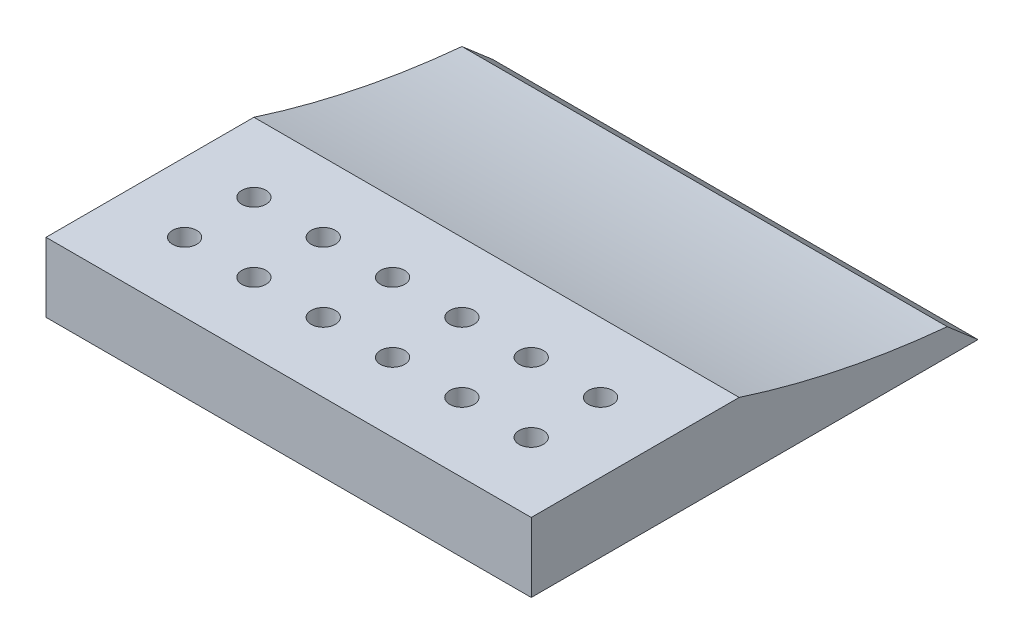
ISO-10303-21;
HEADER;
FILE_DESCRIPTION(('STEP AP214'),'2;1');
FILE_NAME('part.step','',(''),(''),'','','');
FILE_SCHEMA(('AUTOMOTIVE_DESIGN { 1 0 10303 214 1 1 1 1 }'));
ENDSEC;
DATA;
#1=APPLICATION_CONTEXT('core data for automotive mechanical design processes');
#2=APPLICATION_PROTOCOL_DEFINITION('international standard','automotive_design',2000,#1);
#3=PRODUCT_CONTEXT('',#1,'mechanical');
#4=PRODUCT('Part','Part','',(#3));
#5=PRODUCT_RELATED_PRODUCT_CATEGORY('part','',(#4));
#6=PRODUCT_DEFINITION_FORMATION('','',#4);
#7=PRODUCT_DEFINITION_CONTEXT('part definition',#1,'design');
#8=PRODUCT_DEFINITION('design','',#6,#7);
#9=PRODUCT_DEFINITION_SHAPE('','',#8);
#10=(LENGTH_UNIT() NAMED_UNIT(*) SI_UNIT(.MILLI.,.METRE.));
#11=(NAMED_UNIT(*) PLANE_ANGLE_UNIT() SI_UNIT($,.RADIAN.));
#12=(NAMED_UNIT(*) SI_UNIT($,.STERADIAN.) SOLID_ANGLE_UNIT());
#13=UNCERTAINTY_MEASURE_WITH_UNIT(LENGTH_MEASURE(1.E-05),#10,'distance_accuracy_value','');
#14=(GEOMETRIC_REPRESENTATION_CONTEXT(3) GLOBAL_UNCERTAINTY_ASSIGNED_CONTEXT((#13)) GLOBAL_UNIT_ASSIGNED_CONTEXT((#10,
#11,#12)) REPRESENTATION_CONTEXT('',''));
#15=CARTESIAN_POINT('',(0.,0.,0.));
#16=DIRECTION('',(0.,0.,1.));
#17=DIRECTION('',(1.,0.,0.));
#18=AXIS2_PLACEMENT_3D('',#15,#16,#17);
#19=CARTESIAN_POINT('',(60.,-0.000999999999999265,-19.9910811575087));
#20=DIRECTION('',(0.,1.,0.));
#21=DIRECTION('',(0.,0.,1.));
#22=AXIS2_PLACEMENT_3D('',#19,#20,#21);
#23=CYLINDRICAL_SURFACE('',#22,1.75);
#24=CARTESIAN_POINT('',(60.,10.,-19.9910811575087));
#25=DIRECTION('',(0.,1.,0.));
#26=DIRECTION('',(0.,0.,1.));
#27=AXIS2_PLACEMENT_3D('',#24,#25,#26);
#28=CIRCLE('',#27,1.75);
#29=CARTESIAN_POINT('',(60.,10.,-18.2410811575087));
#30=VERTEX_POINT('',#29);
#31=EDGE_CURVE('E200',#30,#30,#28,.T.);
#32=ORIENTED_EDGE('',*,*,#31,.T.);
#33=EDGE_LOOP('',(#32));
#34=FACE_BOUND('',#33,.T.);
#35=CARTESIAN_POINT('',(60.,3.,-19.9910811575087));
#36=DIRECTION('',(0.,-1.,0.));
#37=DIRECTION('',(0.,0.,-1.));
#38=AXIS2_PLACEMENT_3D('',#35,#36,#37);
#39=CIRCLE('',#38,1.75);
#40=CARTESIAN_POINT('',(60.,3.,-21.7410811575087));
#41=VERTEX_POINT('',#40);
#42=EDGE_CURVE('E49',#41,#41,#39,.F.);
#43=ORIENTED_EDGE('',*,*,#42,.F.);
#44=EDGE_LOOP('',(#43));
#45=FACE_BOUND('',#44,.T.);
#46=ADVANCED_FACE('F45',(#34,#45),#23,.F.);
#47=CARTESIAN_POINT('',(10.0000000000001,-0.000999999999999265,-9.99108115750836));
#48=DIRECTION('',(0.,1.,0.));
#49=DIRECTION('',(0.,0.,1.));
#50=AXIS2_PLACEMENT_3D('',#47,#48,#49);
#51=CYLINDRICAL_SURFACE('',#50,1.75);
#52=CARTESIAN_POINT('',(10.0000000000001,10.,-9.99108115750836));
#53=DIRECTION('',(0.,1.,0.));
#54=DIRECTION('',(0.,0.,1.));
#55=AXIS2_PLACEMENT_3D('',#52,#53,#54);
#56=CIRCLE('',#55,1.75);
#57=CARTESIAN_POINT('',(10.0000000000001,10.,-8.24108115750836));
#58=VERTEX_POINT('',#57);
#59=EDGE_CURVE('E164',#58,#58,#56,.T.);
#60=ORIENTED_EDGE('',*,*,#59,.T.);
#61=EDGE_LOOP('',(#60));
#62=FACE_BOUND('',#61,.T.);
#63=CARTESIAN_POINT('',(10.0000000000001,3.,-9.99108115750836));
#64=DIRECTION('',(0.,-1.,0.));
#65=DIRECTION('',(0.,0.,-1.));
#66=AXIS2_PLACEMENT_3D('',#63,#64,#65);
#67=CIRCLE('',#66,1.75);
#68=CARTESIAN_POINT('',(10.0000000000001,3.,-11.7410811575084));
#69=VERTEX_POINT('',#68);
#70=EDGE_CURVE('E157',#69,#69,#67,.F.);
#71=ORIENTED_EDGE('',*,*,#70,.F.);
#72=EDGE_LOOP('',(#71));
#73=FACE_BOUND('',#72,.T.);
#74=ADVANCED_FACE('F266',(#62,#73),#51,.F.);
#75=CARTESIAN_POINT('',(20.0000000000001,-0.000999999999999265,-9.99108115750843));
#76=DIRECTION('',(0.,1.,0.));
#77=DIRECTION('',(0.,0.,1.));
#78=AXIS2_PLACEMENT_3D('',#75,#76,#77);
#79=CYLINDRICAL_SURFACE('',#78,1.75);
#80=CARTESIAN_POINT('',(20.0000000000001,10.,-9.99108115750843));
#81=DIRECTION('',(0.,1.,0.));
#82=DIRECTION('',(0.,0.,1.));
#83=AXIS2_PLACEMENT_3D('',#80,#81,#82);
#84=CIRCLE('',#83,1.75);
#85=CARTESIAN_POINT('',(20.0000000000001,10.,-8.24108115750843));
#86=VERTEX_POINT('',#85);
#87=EDGE_CURVE('E169',#86,#86,#84,.T.);
#88=ORIENTED_EDGE('',*,*,#87,.T.);
#89=EDGE_LOOP('',(#88));
#90=FACE_BOUND('',#89,.T.);
#91=CARTESIAN_POINT('',(20.0000000000001,3.,-9.99108115750843));
#92=DIRECTION('',(0.,-1.,0.));
#93=DIRECTION('',(0.,0.,-1.));
#94=AXIS2_PLACEMENT_3D('',#91,#92,#93);
#95=CIRCLE('',#94,1.75);
#96=CARTESIAN_POINT('',(20.0000000000001,3.,-11.7410811575084));
#97=VERTEX_POINT('',#96);
#98=EDGE_CURVE('E154',#97,#97,#95,.F.);
#99=ORIENTED_EDGE('',*,*,#98,.F.);
#100=EDGE_LOOP('',(#99));
#101=FACE_BOUND('',#100,.T.);
#102=ADVANCED_FACE('F273',(#90,#101),#79,.F.);
#103=CARTESIAN_POINT('',(30.0000000000001,-0.000999999999999265,-9.99108115750851));
#104=DIRECTION('',(0.,1.,0.));
#105=DIRECTION('',(0.,0.,1.));
#106=AXIS2_PLACEMENT_3D('',#103,#104,#105);
#107=CYLINDRICAL_SURFACE('',#106,1.75000000000001);
#108=CARTESIAN_POINT('',(30.0000000000001,10.,-9.99108115750851));
#109=DIRECTION('',(0.,1.,0.));
#110=DIRECTION('',(0.,0.,1.));
#111=AXIS2_PLACEMENT_3D('',#108,#109,#110);
#112=CIRCLE('',#111,1.75000000000001);
#113=CARTESIAN_POINT('',(30.0000000000001,10.,-8.2410811575085));
#114=VERTEX_POINT('',#113);
#115=EDGE_CURVE('E175',#114,#114,#112,.T.);
#116=ORIENTED_EDGE('',*,*,#115,.T.);
#117=EDGE_LOOP('',(#116));
#118=FACE_BOUND('',#117,.T.);
#119=CARTESIAN_POINT('',(30.0000000000001,3.,-9.99108115750851));
#120=DIRECTION('',(0.,-1.,0.));
#121=DIRECTION('',(0.,0.,-1.));
#122=AXIS2_PLACEMENT_3D('',#119,#120,#121);
#123=CIRCLE('',#122,1.75000000000001);
#124=CARTESIAN_POINT('',(30.0000000000001,3.,-11.7410811575085));
#125=VERTEX_POINT('',#124);
#126=EDGE_CURVE('E150',#125,#125,#123,.F.);
#127=ORIENTED_EDGE('',*,*,#126,.F.);
#128=EDGE_LOOP('',(#127));
#129=FACE_BOUND('',#128,.T.);
#130=ADVANCED_FACE('F293',(#118,#129),#107,.F.);
#131=CARTESIAN_POINT('',(50.,-0.000999999999999265,-19.9910811575086));
#132=DIRECTION('',(0.,1.,0.));
#133=DIRECTION('',(0.,0.,1.));
#134=AXIS2_PLACEMENT_3D('',#131,#132,#133);
#135=CYLINDRICAL_SURFACE('',#134,1.75);
#136=CARTESIAN_POINT('',(50.,10.,-19.9910811575086));
#137=DIRECTION('',(0.,1.,0.));
#138=DIRECTION('',(0.,0.,1.));
#139=AXIS2_PLACEMENT_3D('',#136,#137,#138);
#140=CIRCLE('',#139,1.75);
#141=CARTESIAN_POINT('',(50.,10.,-18.2410811575086));
#142=VERTEX_POINT('',#141);
#143=EDGE_CURVE('E196',#142,#142,#140,.T.);
#144=ORIENTED_EDGE('',*,*,#143,.T.);
#145=EDGE_LOOP('',(#144));
#146=FACE_BOUND('',#145,.T.);
#147=CARTESIAN_POINT('',(50.,3.,-19.9910811575086));
#148=DIRECTION('',(0.,-1.,0.));
#149=DIRECTION('',(0.,0.,-1.));
#150=AXIS2_PLACEMENT_3D('',#147,#148,#149);
#151=CIRCLE('',#150,1.75);
#152=CARTESIAN_POINT('',(50.,3.,-21.7410811575086));
#153=VERTEX_POINT('',#152);
#154=EDGE_CURVE('E146',#153,#153,#151,.F.);
#155=ORIENTED_EDGE('',*,*,#154,.F.);
#156=EDGE_LOOP('',(#155));
#157=FACE_BOUND('',#156,.T.);
#158=ADVANCED_FACE('F289',(#146,#157),#135,.F.);
#159=CARTESIAN_POINT('',(40.,-0.000999999999999265,-19.9910811575086));
#160=DIRECTION('',(0.,1.,0.));
#161=DIRECTION('',(0.,0.,1.));
#162=AXIS2_PLACEMENT_3D('',#159,#160,#161);
#163=CYLINDRICAL_SURFACE('',#162,1.75);
#164=CARTESIAN_POINT('',(40.,10.,-19.9910811575086));
#165=DIRECTION('',(0.,1.,0.));
#166=DIRECTION('',(0.,0.,1.));
#167=AXIS2_PLACEMENT_3D('',#164,#165,#166);
#168=CIRCLE('',#167,1.75);
#169=CARTESIAN_POINT('',(40.,10.,-18.2410811575086));
#170=VERTEX_POINT('',#169);
#171=EDGE_CURVE('E201',#170,#170,#168,.T.);
#172=ORIENTED_EDGE('',*,*,#171,.T.);
#173=EDGE_LOOP('',(#172));
#174=FACE_BOUND('',#173,.T.);
#175=CARTESIAN_POINT('',(40.,3.,-19.9910811575086));
#176=DIRECTION('',(0.,-1.,0.));
#177=DIRECTION('',(0.,0.,-1.));
#178=AXIS2_PLACEMENT_3D('',#175,#176,#177);
#179=CIRCLE('',#178,1.75);
#180=CARTESIAN_POINT('',(40.,3.,-21.7410811575086));
#181=VERTEX_POINT('',#180);
#182=EDGE_CURVE('E142',#181,#181,#179,.F.);
#183=ORIENTED_EDGE('',*,*,#182,.F.);
#184=EDGE_LOOP('',(#183));
#185=FACE_BOUND('',#184,.T.);
#186=ADVANCED_FACE('F285',(#174,#185),#163,.F.);
#187=CARTESIAN_POINT('',(30.,-0.000999999999999265,-19.9910811575085));
#188=DIRECTION('',(0.,1.,0.));
#189=DIRECTION('',(0.,0.,1.));
#190=AXIS2_PLACEMENT_3D('',#187,#188,#189);
#191=CYLINDRICAL_SURFACE('',#190,1.75000000000001);
#192=CARTESIAN_POINT('',(30.,10.,-19.9910811575085));
#193=DIRECTION('',(0.,1.,0.));
#194=DIRECTION('',(0.,0.,1.));
#195=AXIS2_PLACEMENT_3D('',#192,#193,#194);
#196=CIRCLE('',#195,1.75000000000001);
#197=CARTESIAN_POINT('',(30.,10.,-18.2410811575085));
#198=VERTEX_POINT('',#197);
#199=EDGE_CURVE('E205',#198,#198,#196,.T.);
#200=ORIENTED_EDGE('',*,*,#199,.T.);
#201=EDGE_LOOP('',(#200));
#202=FACE_BOUND('',#201,.T.);
#203=CARTESIAN_POINT('',(30.,3.,-19.9910811575085));
#204=DIRECTION('',(0.,-1.,0.));
#205=DIRECTION('',(0.,0.,-1.));
#206=AXIS2_PLACEMENT_3D('',#203,#204,#205);
#207=CIRCLE('',#206,1.75000000000001);
#208=CARTESIAN_POINT('',(30.,3.,-21.7410811575085));
#209=VERTEX_POINT('',#208);
#210=EDGE_CURVE('E138',#209,#209,#207,.F.);
#211=ORIENTED_EDGE('',*,*,#210,.F.);
#212=EDGE_LOOP('',(#211));
#213=FACE_BOUND('',#212,.T.);
#214=ADVANCED_FACE('F281',(#202,#213),#191,.F.);
#215=CARTESIAN_POINT('',(20.,-0.000999999999999265,-19.9910811575084));
#216=DIRECTION('',(0.,1.,0.));
#217=DIRECTION('',(0.,0.,1.));
#218=AXIS2_PLACEMENT_3D('',#215,#216,#217);
#219=CYLINDRICAL_SURFACE('',#218,1.75);
#220=CARTESIAN_POINT('',(20.,10.,-19.9910811575084));
#221=DIRECTION('',(0.,1.,0.));
#222=DIRECTION('',(0.,0.,1.));
#223=AXIS2_PLACEMENT_3D('',#220,#221,#222);
#224=CIRCLE('',#223,1.75);
#225=CARTESIAN_POINT('',(20.,10.,-18.2410811575084));
#226=VERTEX_POINT('',#225);
#227=EDGE_CURVE('E192',#226,#226,#224,.T.);
#228=ORIENTED_EDGE('',*,*,#227,.T.);
#229=EDGE_LOOP('',(#228));
#230=FACE_BOUND('',#229,.T.);
#231=CARTESIAN_POINT('',(20.,3.,-19.9910811575084));
#232=DIRECTION('',(0.,-1.,0.));
#233=DIRECTION('',(0.,0.,-1.));
#234=AXIS2_PLACEMENT_3D('',#231,#232,#233);
#235=CIRCLE('',#234,1.75);
#236=CARTESIAN_POINT('',(20.,3.,-21.7410811575084));
#237=VERTEX_POINT('',#236);
#238=EDGE_CURVE('E134',#237,#237,#235,.F.);
#239=ORIENTED_EDGE('',*,*,#238,.F.);
#240=EDGE_LOOP('',(#239));
#241=FACE_BOUND('',#240,.T.);
#242=ADVANCED_FACE('F277',(#230,#241),#219,.F.);
#243=CARTESIAN_POINT('',(40.0000000000001,-0.000999999999999265,-9.99108115750858));
#244=DIRECTION('',(0.,1.,0.));
#245=DIRECTION('',(0.,0.,1.));
#246=AXIS2_PLACEMENT_3D('',#243,#244,#245);
#247=CYLINDRICAL_SURFACE('',#246,1.75);
#248=CARTESIAN_POINT('',(40.0000000000001,10.,-9.99108115750858));
#249=DIRECTION('',(0.,1.,0.));
#250=DIRECTION('',(0.,0.,1.));
#251=AXIS2_PLACEMENT_3D('',#248,#249,#250);
#252=CIRCLE('',#251,1.75);
#253=CARTESIAN_POINT('',(40.0000000000001,10.,-8.24108115750858));
#254=VERTEX_POINT('',#253);
#255=EDGE_CURVE('E184',#254,#254,#252,.T.);
#256=ORIENTED_EDGE('',*,*,#255,.T.);
#257=EDGE_LOOP('',(#256));
#258=FACE_BOUND('',#257,.T.);
#259=CARTESIAN_POINT('',(40.0000000000001,3.,-9.99108115750858));
#260=DIRECTION('',(0.,-1.,0.));
#261=DIRECTION('',(0.,0.,-1.));
#262=AXIS2_PLACEMENT_3D('',#259,#260,#261);
#263=CIRCLE('',#262,1.75);
#264=CARTESIAN_POINT('',(40.0000000000001,3.,-11.7410811575086));
#265=VERTEX_POINT('',#264);
#266=EDGE_CURVE('E130',#265,#265,#263,.F.);
#267=ORIENTED_EDGE('',*,*,#266,.F.);
#268=EDGE_LOOP('',(#267));
#269=FACE_BOUND('',#268,.T.);
#270=ADVANCED_FACE('F280',(#258,#269),#247,.F.);
#271=CARTESIAN_POINT('',(50.0000000000001,-0.000999999999999265,-9.99108115750865));
#272=DIRECTION('',(0.,1.,0.));
#273=DIRECTION('',(0.,0.,1.));
#274=AXIS2_PLACEMENT_3D('',#271,#272,#273);
#275=CYLINDRICAL_SURFACE('',#274,1.75);
#276=CARTESIAN_POINT('',(50.0000000000001,10.,-9.99108115750865));
#277=DIRECTION('',(0.,1.,0.));
#278=DIRECTION('',(0.,0.,1.));
#279=AXIS2_PLACEMENT_3D('',#276,#277,#278);
#280=CIRCLE('',#279,1.75);
#281=CARTESIAN_POINT('',(50.0000000000001,10.,-8.24108115750864));
#282=VERTEX_POINT('',#281);
#283=EDGE_CURVE('E179',#282,#282,#280,.T.);
#284=ORIENTED_EDGE('',*,*,#283,.T.);
#285=EDGE_LOOP('',(#284));
#286=FACE_BOUND('',#285,.T.);
#287=CARTESIAN_POINT('',(50.0000000000001,3.,-9.99108115750865));
#288=DIRECTION('',(0.,-1.,0.));
#289=DIRECTION('',(0.,0.,-1.));
#290=AXIS2_PLACEMENT_3D('',#287,#288,#289);
#291=CIRCLE('',#290,1.75);
#292=CARTESIAN_POINT('',(50.0000000000001,3.,-11.7410811575086));
#293=VERTEX_POINT('',#292);
#294=EDGE_CURVE('E126',#293,#293,#291,.F.);
#295=ORIENTED_EDGE('',*,*,#294,.F.);
#296=EDGE_LOOP('',(#295));
#297=FACE_BOUND('',#296,.T.);
#298=ADVANCED_FACE('F299',(#286,#297),#275,.F.);
#299=CARTESIAN_POINT('',(60.0000000000001,-0.000999999999999265,-9.99108115750871));
#300=DIRECTION('',(0.,1.,0.));
#301=DIRECTION('',(0.,0.,1.));
#302=AXIS2_PLACEMENT_3D('',#299,#300,#301);
#303=CYLINDRICAL_SURFACE('',#302,1.75);
#304=CARTESIAN_POINT('',(60.0000000000001,10.,-9.99108115750871));
#305=DIRECTION('',(0.,1.,0.));
#306=DIRECTION('',(0.,0.,1.));
#307=AXIS2_PLACEMENT_3D('',#304,#305,#306);
#308=CIRCLE('',#307,1.75);
#309=CARTESIAN_POINT('',(60.0000000000001,10.,-8.24108115750871));
#310=VERTEX_POINT('',#309);
#311=EDGE_CURVE('E183',#310,#310,#308,.T.);
#312=ORIENTED_EDGE('',*,*,#311,.T.);
#313=EDGE_LOOP('',(#312));
#314=FACE_BOUND('',#313,.T.);
#315=CARTESIAN_POINT('',(60.0000000000001,3.,-9.99108115750871));
#316=DIRECTION('',(0.,-1.,0.));
#317=DIRECTION('',(0.,0.,-1.));
#318=AXIS2_PLACEMENT_3D('',#315,#316,#317);
#319=CIRCLE('',#318,1.75);
#320=CARTESIAN_POINT('',(60.0000000000001,3.,-11.7410811575087));
#321=VERTEX_POINT('',#320);
#322=EDGE_CURVE('E121',#321,#321,#319,.F.);
#323=ORIENTED_EDGE('',*,*,#322,.F.);
#324=EDGE_LOOP('',(#323));
#325=FACE_BOUND('',#324,.T.);
#326=ADVANCED_FACE('F295',(#314,#325),#303,.F.);
#327=CARTESIAN_POINT('',(10.,-0.000999999999999265,-19.9910811575084));
#328=DIRECTION('',(0.,1.,0.));
#329=DIRECTION('',(0.,0.,1.));
#330=AXIS2_PLACEMENT_3D('',#327,#328,#329);
#331=CYLINDRICAL_SURFACE('',#330,1.75);
#332=CARTESIAN_POINT('',(10.,10.,-19.9910811575084));
#333=DIRECTION('',(0.,1.,0.));
#334=DIRECTION('',(0.,0.,1.));
#335=AXIS2_PLACEMENT_3D('',#332,#333,#334);
#336=CIRCLE('',#335,1.75);
#337=CARTESIAN_POINT('',(10.,10.,-18.2410811575084));
#338=VERTEX_POINT('',#337);
#339=EDGE_CURVE('E188',#338,#338,#336,.T.);
#340=ORIENTED_EDGE('',*,*,#339,.T.);
#341=EDGE_LOOP('',(#340));
#342=FACE_BOUND('',#341,.T.);
#343=CARTESIAN_POINT('',(10.,3.,-19.9910811575084));
#344=DIRECTION('',(0.,-1.,0.));
#345=DIRECTION('',(0.,0.,-1.));
#346=AXIS2_PLACEMENT_3D('',#343,#344,#345);
#347=CIRCLE('',#346,1.75);
#348=CARTESIAN_POINT('',(10.,3.,-21.7410811575084));
#349=VERTEX_POINT('',#348);
#350=EDGE_CURVE('E117',#349,#349,#347,.F.);
#351=ORIENTED_EDGE('',*,*,#350,.F.);
#352=EDGE_LOOP('',(#351));
#353=FACE_BOUND('',#352,.T.);
#354=ADVANCED_FACE('F298',(#342,#353),#331,.F.);
#355=CARTESIAN_POINT('',(70.,0.,0.));
#356=DIRECTION('',(0.,0.,-1.));
#357=DIRECTION('',(-1.,0.,0.));
#358=AXIS2_PLACEMENT_3D('',#355,#356,#357);
#359=PLANE('',#358);
#360=DIRECTION('',(0.,-1.,0.));
#361=VECTOR('',#360,1.);
#362=CARTESIAN_POINT('',(0.,0.,0.));
#363=LINE('',#362,#361);
#364=CARTESIAN_POINT('',(0.,10.,0.));
#365=VERTEX_POINT('',#364);
#366=CARTESIAN_POINT('',(0.,0.,0.));
#367=VERTEX_POINT('',#366);
#368=EDGE_CURVE('E102',#365,#367,#363,.T.);
#369=ORIENTED_EDGE('',*,*,#368,.T.);
#370=DIRECTION('',(-1.,0.,0.));
#371=VECTOR('',#370,1.);
#372=CARTESIAN_POINT('',(70.,0.,0.));
#373=LINE('',#372,#371);
#374=CARTESIAN_POINT('',(70.,0.,0.));
#375=VERTEX_POINT('',#374);
#376=EDGE_CURVE('E11',#375,#367,#373,.T.);
#377=ORIENTED_EDGE('',*,*,#376,.F.);
#378=DIRECTION('',(0.,-1.,0.));
#379=VECTOR('',#378,1.);
#380=CARTESIAN_POINT('',(70.,0.,0.));
#381=LINE('',#380,#379);
#382=CARTESIAN_POINT('',(70.,10.,0.));
#383=VERTEX_POINT('',#382);
#384=EDGE_CURVE('E96',#383,#375,#381,.T.);
#385=ORIENTED_EDGE('',*,*,#384,.F.);
#386=DIRECTION('',(-1.,0.,0.));
#387=VECTOR('',#386,1.);
#388=CARTESIAN_POINT('',(70.,10.,0.));
#389=LINE('',#388,#387);
#390=EDGE_CURVE('E55',#383,#365,#389,.T.);
#391=ORIENTED_EDGE('',*,*,#390,.T.);
#392=EDGE_LOOP('',(#369,#377,#385,#391));
#393=FACE_BOUND('',#392,.T.);
#394=ADVANCED_FACE('F47',(#393),#359,.F.);
#395=CARTESIAN_POINT('',(70.,0.,0.));
#396=DIRECTION('',(0.,1.,0.));
#397=DIRECTION('',(0.,0.,1.));
#398=AXIS2_PLACEMENT_3D('',#395,#396,#397);
#399=PLANE('',#398);
#400=CARTESIAN_POINT('',(60.0000000000001,0.,-9.99108115750836));
#401=DIRECTION('',(0.,-1.,0.));
#402=DIRECTION('',(0.,0.,-1.));
#403=AXIS2_PLACEMENT_3D('',#400,#401,#402);
#404=CIRCLE('',#403,2.99999999999999);
#405=CARTESIAN_POINT('',(60.0000000000001,0.,-12.9910811575084));
#406=VERTEX_POINT('',#405);
#407=EDGE_CURVE('E458',#406,#406,#404,.T.);
#408=ORIENTED_EDGE('',*,*,#407,.F.);
#409=EDGE_LOOP('',(#408));
#410=FACE_BOUND('',#409,.T.);
#411=CARTESIAN_POINT('',(20.0000000000002,0.,-19.9910811575084));
#412=DIRECTION('',(0.,-1.,0.));
#413=DIRECTION('',(0.,0.,-1.));
#414=AXIS2_PLACEMENT_3D('',#411,#412,#413);
#415=CIRCLE('',#414,3.);
#416=CARTESIAN_POINT('',(20.0000000000002,0.,-22.9910811575084));
#417=VERTEX_POINT('',#416);
#418=EDGE_CURVE('E467',#417,#417,#415,.T.);
#419=ORIENTED_EDGE('',*,*,#418,.F.);
#420=EDGE_LOOP('',(#419));
#421=FACE_BOUND('',#420,.T.);
#422=CARTESIAN_POINT('',(30.0000000000002,0.,-19.9910811575084));
#423=DIRECTION('',(0.,-1.,0.));
#424=DIRECTION('',(0.,0.,-1.));
#425=AXIS2_PLACEMENT_3D('',#422,#423,#424);
#426=CIRCLE('',#425,3.);
#427=CARTESIAN_POINT('',(30.0000000000002,0.,-22.9910811575084));
#428=VERTEX_POINT('',#427);
#429=EDGE_CURVE('E446',#428,#428,#426,.T.);
#430=ORIENTED_EDGE('',*,*,#429,.F.);
#431=EDGE_LOOP('',(#430));
#432=FACE_BOUND('',#431,.T.);
#433=CARTESIAN_POINT('',(40.0000000000002,0.,-19.9910811575084));
#434=DIRECTION('',(0.,-1.,0.));
#435=DIRECTION('',(0.,0.,-1.));
#436=AXIS2_PLACEMENT_3D('',#433,#434,#435);
#437=CIRCLE('',#436,3.);
#438=CARTESIAN_POINT('',(40.0000000000002,0.,-22.9910811575084));
#439=VERTEX_POINT('',#438);
#440=EDGE_CURVE('E426',#439,#439,#437,.T.);
#441=ORIENTED_EDGE('',*,*,#440,.F.);
#442=EDGE_LOOP('',(#441));
#443=FACE_BOUND('',#442,.T.);
#444=CARTESIAN_POINT('',(50.0000000000001,0.,-9.99108115750836));
#445=DIRECTION('',(0.,-1.,0.));
#446=DIRECTION('',(0.,0.,-1.));
#447=AXIS2_PLACEMENT_3D('',#444,#445,#446);
#448=CIRCLE('',#447,3.);
#449=CARTESIAN_POINT('',(50.0000000000001,0.,-12.9910811575084));
#450=VERTEX_POINT('',#449);
#451=EDGE_CURVE('E499',#450,#450,#448,.T.);
#452=ORIENTED_EDGE('',*,*,#451,.F.);
#453=EDGE_LOOP('',(#452));
#454=FACE_BOUND('',#453,.T.);
#455=CARTESIAN_POINT('',(40.0000000000001,0.,-9.99108115750836));
#456=DIRECTION('',(0.,-1.,0.));
#457=DIRECTION('',(0.,0.,-1.));
#458=AXIS2_PLACEMENT_3D('',#455,#456,#457);
#459=CIRCLE('',#458,3.);
#460=CARTESIAN_POINT('',(40.0000000000001,0.,-12.9910811575084));
#461=VERTEX_POINT('',#460);
#462=EDGE_CURVE('E491',#461,#461,#459,.T.);
#463=ORIENTED_EDGE('',*,*,#462,.F.);
#464=EDGE_LOOP('',(#463));
#465=FACE_BOUND('',#464,.T.);
#466=CARTESIAN_POINT('',(30.0000000000001,0.,-9.99108115750836));
#467=DIRECTION('',(0.,-1.,0.));
#468=DIRECTION('',(0.,0.,-1.));
#469=AXIS2_PLACEMENT_3D('',#466,#467,#468);
#470=CIRCLE('',#469,3.);
#471=CARTESIAN_POINT('',(30.0000000000001,0.,-12.9910811575084));
#472=VERTEX_POINT('',#471);
#473=EDGE_CURVE('E483',#472,#472,#470,.T.);
#474=ORIENTED_EDGE('',*,*,#473,.F.);
#475=EDGE_LOOP('',(#474));
#476=FACE_BOUND('',#475,.T.);
#477=CARTESIAN_POINT('',(20.0000000000001,0.,-9.99108115750836));
#478=DIRECTION('',(0.,-1.,0.));
#479=DIRECTION('',(0.,0.,-1.));
#480=AXIS2_PLACEMENT_3D('',#477,#478,#479);
#481=CIRCLE('',#480,3.);
#482=CARTESIAN_POINT('',(20.0000000000001,0.,-12.9910811575084));
#483=VERTEX_POINT('',#482);
#484=EDGE_CURVE('E474',#483,#483,#481,.T.);
#485=ORIENTED_EDGE('',*,*,#484,.F.);
#486=EDGE_LOOP('',(#485));
#487=FACE_BOUND('',#486,.T.);
#488=CARTESIAN_POINT('',(50.0000000000002,0.,-19.9910811575084));
#489=DIRECTION('',(0.,-1.,0.));
#490=DIRECTION('',(0.,0.,-1.));
#491=AXIS2_PLACEMENT_3D('',#488,#489,#490);
#492=CIRCLE('',#491,3.);
#493=CARTESIAN_POINT('',(50.0000000000002,0.,-22.9910811575084));
#494=VERTEX_POINT('',#493);
#495=EDGE_CURVE('E418',#494,#494,#492,.T.);
#496=ORIENTED_EDGE('',*,*,#495,.F.);
#497=EDGE_LOOP('',(#496));
#498=FACE_BOUND('',#497,.T.);
#499=CARTESIAN_POINT('',(60.0000000000002,0.,-19.9910811575084));
#500=DIRECTION('',(0.,-1.,0.));
#501=DIRECTION('',(0.,0.,-1.));
#502=AXIS2_PLACEMENT_3D('',#499,#500,#501);
#503=CIRCLE('',#502,3.);
#504=CARTESIAN_POINT('',(60.0000000000002,0.,-22.9910811575084));
#505=VERTEX_POINT('',#504);
#506=EDGE_CURVE('E428',#505,#505,#503,.T.);
#507=ORIENTED_EDGE('',*,*,#506,.F.);
#508=EDGE_LOOP('',(#507));
#509=FACE_BOUND('',#508,.T.);
#510=CARTESIAN_POINT('',(10.0000000000002,0.,-19.9910811575084));
#511=DIRECTION('',(0.,-1.,0.));
#512=DIRECTION('',(0.,0.,-1.));
#513=AXIS2_PLACEMENT_3D('',#510,#511,#512);
#514=CIRCLE('',#513,3.);
#515=CARTESIAN_POINT('',(10.0000000000002,0.,-22.9910811575084));
#516=VERTEX_POINT('',#515);
#517=EDGE_CURVE('E438',#516,#516,#514,.T.);
#518=ORIENTED_EDGE('',*,*,#517,.F.);
#519=EDGE_LOOP('',(#518));
#520=FACE_BOUND('',#519,.T.);
#521=CARTESIAN_POINT('',(10.0000000000001,0.,-9.99108115750836));
#522=DIRECTION('',(0.,-1.,0.));
#523=DIRECTION('',(0.,0.,-1.));
#524=AXIS2_PLACEMENT_3D('',#521,#522,#523);
#525=CIRCLE('',#524,3.);
#526=CARTESIAN_POINT('',(10.0000000000001,0.,-12.9910811575084));
#527=VERTEX_POINT('',#526);
#528=EDGE_CURVE('E478',#527,#527,#525,.T.);
#529=ORIENTED_EDGE('',*,*,#528,.F.);
#530=EDGE_LOOP('',(#529));
#531=FACE_BOUND('',#530,.T.);
#532=DIRECTION('',(0.,0.,-1.));
#533=VECTOR('',#532,1.);
#534=CARTESIAN_POINT('',(0.,0.,0.));
#535=LINE('',#534,#533);
#536=CARTESIAN_POINT('',(0.,0.,-64.4409169204969));
#537=VERTEX_POINT('',#536);
#538=EDGE_CURVE('E97',#367,#537,#535,.T.);
#539=ORIENTED_EDGE('',*,*,#538,.T.);
#540=DIRECTION('',(1.,0.,0.));
#541=VECTOR('',#540,1.);
#542=CARTESIAN_POINT('',(0.,0.,-64.4409169204969));
#543=LINE('',#542,#541);
#544=CARTESIAN_POINT('',(70.,0.,-64.4409169204969));
#545=VERTEX_POINT('',#544);
#546=EDGE_CURVE('E220',#537,#545,#543,.T.);
#547=ORIENTED_EDGE('',*,*,#546,.T.);
#548=DIRECTION('',(0.,0.,-1.));
#549=VECTOR('',#548,1.);
#550=CARTESIAN_POINT('',(70.,0.,0.));
#551=LINE('',#550,#549);
#552=EDGE_CURVE('E236',#375,#545,#551,.T.);
#553=ORIENTED_EDGE('',*,*,#552,.F.);
#554=ORIENTED_EDGE('',*,*,#376,.T.);
#555=EDGE_LOOP('',(#539,#547,#553,#554));
#556=FACE_BOUND('',#555,.T.);
#557=ADVANCED_FACE('F247',(#410,#421,#432,#443,#454,#465,#476,#487,#498,#509,#520,#531,#556),
#399,.F.);
#558=CARTESIAN_POINT('',(70.,10.,0.));
#559=DIRECTION('',(0.,-1.,0.));
#560=DIRECTION('',(0.,0.,-1.));
#561=AXIS2_PLACEMENT_3D('',#558,#559,#560);
#562=PLANE('',#561);
#563=ORIENTED_EDGE('',*,*,#339,.F.);
#564=EDGE_LOOP('',(#563));
#565=FACE_BOUND('',#564,.T.);
#566=ORIENTED_EDGE('',*,*,#311,.F.);
#567=EDGE_LOOP('',(#566));
#568=FACE_BOUND('',#567,.T.);
#569=ORIENTED_EDGE('',*,*,#283,.F.);
#570=EDGE_LOOP('',(#569));
#571=FACE_BOUND('',#570,.T.);
#572=ORIENTED_EDGE('',*,*,#255,.F.);
#573=EDGE_LOOP('',(#572));
#574=FACE_BOUND('',#573,.T.);
#575=ORIENTED_EDGE('',*,*,#227,.F.);
#576=EDGE_LOOP('',(#575));
#577=FACE_BOUND('',#576,.T.);
#578=ORIENTED_EDGE('',*,*,#199,.F.);
#579=EDGE_LOOP('',(#578));
#580=FACE_BOUND('',#579,.T.);
#581=ORIENTED_EDGE('',*,*,#171,.F.);
#582=EDGE_LOOP('',(#581));
#583=FACE_BOUND('',#582,.T.);
#584=ORIENTED_EDGE('',*,*,#143,.F.);
#585=EDGE_LOOP('',(#584));
#586=FACE_BOUND('',#585,.T.);
#587=ORIENTED_EDGE('',*,*,#115,.F.);
#588=EDGE_LOOP('',(#587));
#589=FACE_BOUND('',#588,.T.);
#590=ORIENTED_EDGE('',*,*,#87,.F.);
#591=EDGE_LOOP('',(#590));
#592=FACE_BOUND('',#591,.T.);
#593=ORIENTED_EDGE('',*,*,#59,.F.);
#594=EDGE_LOOP('',(#593));
#595=FACE_BOUND('',#594,.T.);
#596=ORIENTED_EDGE('',*,*,#31,.F.);
#597=EDGE_LOOP('',(#596));
#598=FACE_BOUND('',#597,.T.);
#599=DIRECTION('',(0.,0.,1.));
#600=VECTOR('',#599,1.);
#601=CARTESIAN_POINT('',(70.,10.,0.));
#602=LINE('',#601,#600);
#603=CARTESIAN_POINT('',(70.,10.,-29.9910811575087));
#604=VERTEX_POINT('',#603);
#605=EDGE_CURVE('E72',#604,#383,#602,.T.);
#606=ORIENTED_EDGE('',*,*,#605,.F.);
#607=DIRECTION('',(1.,0.,0.));
#608=VECTOR('',#607,1.);
#609=CARTESIAN_POINT('',(0.,10.,-29.9910811575087));
#610=LINE('',#609,#608);
#611=CARTESIAN_POINT('',(0.,10.,-29.9910811575087));
#612=VERTEX_POINT('',#611);
#613=EDGE_CURVE('E92',#604,#612,#610,.F.);
#614=ORIENTED_EDGE('',*,*,#613,.T.);
#615=DIRECTION('',(0.,0.,1.));
#616=VECTOR('',#615,1.);
#617=CARTESIAN_POINT('',(0.,10.,0.));
#618=LINE('',#617,#616);
#619=EDGE_CURVE('E86',#612,#365,#618,.T.);
#620=ORIENTED_EDGE('',*,*,#619,.T.);
#621=ORIENTED_EDGE('',*,*,#390,.F.);
#622=EDGE_LOOP('',(#606,#614,#620,#621));
#623=FACE_BOUND('',#622,.T.);
#624=ADVANCED_FACE('F88',(#565,#568,#571,#574,#577,#580,#583,#586,#589,#592,#595,#598,#623),
#562,.F.);
#625=CARTESIAN_POINT('',(70.,0.,0.));
#626=DIRECTION('',(-1.,0.,0.));
#627=DIRECTION('',(0.,0.,1.));
#628=AXIS2_PLACEMENT_3D('',#625,#626,#627);
#629=PLANE('',#628);
#630=ORIENTED_EDGE('',*,*,#552,.T.);
#631=DIRECTION('',(0.,0.653575042126889,0.756861720731624));
#632=VECTOR('',#631,1.);
#633=CARTESIAN_POINT('',(70.,0.,-64.4409169204969));
#634=LINE('',#633,#632);
#635=CARTESIAN_POINT('',(70.,3.83487813413269,-60.));
#636=VERTEX_POINT('',#635);
#637=EDGE_CURVE('E215',#545,#636,#634,.T.);
#638=ORIENTED_EDGE('',*,*,#637,.T.);
#639=CARTESIAN_POINT('',(70.,143.23,-73.));
#640=DIRECTION('',(1.,0.,0.));
#641=DIRECTION('',(0.,0.,-1.));
#642=AXIS2_PLACEMENT_3D('',#639,#640,#641);
#643=CIRCLE('',#642,140.);
#644=EDGE_CURVE('E227',#604,#636,#643,.T.);
#645=ORIENTED_EDGE('',*,*,#644,.F.);
#646=ORIENTED_EDGE('',*,*,#605,.T.);
#647=ORIENTED_EDGE('',*,*,#384,.T.);
#648=EDGE_LOOP('',(#630,#638,#645,#646,#647));
#649=FACE_BOUND('',#648,.T.);
#650=ADVANCED_FACE('F241',(#649),#629,.F.);
#651=CARTESIAN_POINT('',(0.,0.,0.));
#652=DIRECTION('',(-1.,0.,0.));
#653=DIRECTION('',(0.,0.,1.));
#654=AXIS2_PLACEMENT_3D('',#651,#652,#653);
#655=PLANE('',#654);
#656=CARTESIAN_POINT('',(0.,143.23,-73.));
#657=DIRECTION('',(1.,0.,0.));
#658=DIRECTION('',(0.,0.,-1.));
#659=AXIS2_PLACEMENT_3D('',#656,#657,#658);
#660=CIRCLE('',#659,140.);
#661=CARTESIAN_POINT('',(0.,3.83487813413269,-60.));
#662=VERTEX_POINT('',#661);
#663=EDGE_CURVE('E228',#612,#662,#660,.T.);
#664=ORIENTED_EDGE('',*,*,#663,.T.);
#665=DIRECTION('',(0.,0.653575042126889,0.756861720731624));
#666=VECTOR('',#665,1.);
#667=CARTESIAN_POINT('',(0.,0.,-64.4409169204969));
#668=LINE('',#667,#666);
#669=EDGE_CURVE('E216',#537,#662,#668,.T.);
#670=ORIENTED_EDGE('',*,*,#669,.F.);
#671=ORIENTED_EDGE('',*,*,#538,.F.);
#672=ORIENTED_EDGE('',*,*,#368,.F.);
#673=ORIENTED_EDGE('',*,*,#619,.F.);
#674=EDGE_LOOP('',(#664,#670,#671,#672,#673));
#675=FACE_BOUND('',#674,.T.);
#676=ADVANCED_FACE('F105',(#675),#655,.T.);
#677=CARTESIAN_POINT('',(0.,143.23,-73.));
#678=DIRECTION('',(1.,0.,0.));
#679=DIRECTION('',(0.,0.,-1.));
#680=AXIS2_PLACEMENT_3D('',#677,#678,#679);
#681=CYLINDRICAL_SURFACE('',#680,140.);
#682=ORIENTED_EDGE('',*,*,#663,.F.);
#683=ORIENTED_EDGE('',*,*,#613,.F.);
#684=ORIENTED_EDGE('',*,*,#644,.T.);
#685=DIRECTION('',(1.,0.,0.));
#686=VECTOR('',#685,1.);
#687=CARTESIAN_POINT('',(0.,3.83487813413269,-60.));
#688=LINE('',#687,#686);
#689=EDGE_CURVE('E63',#662,#636,#688,.T.);
#690=ORIENTED_EDGE('',*,*,#689,.F.);
#691=EDGE_LOOP('',(#682,#683,#684,#690));
#692=FACE_BOUND('',#691,.T.);
#693=ADVANCED_FACE('F254',(#692),#681,.F.);
#694=CARTESIAN_POINT('',(0.,0.,-64.4409169204969));
#695=DIRECTION('',(0.,0.756861720731624,-0.653575042126889));
#696=DIRECTION('',(0.,0.653575042126889,0.756861720731624));
#697=AXIS2_PLACEMENT_3D('',#694,#695,#696);
#698=PLANE('',#697);
#699=ORIENTED_EDGE('',*,*,#637,.F.);
#700=ORIENTED_EDGE('',*,*,#546,.F.);
#701=ORIENTED_EDGE('',*,*,#669,.T.);
#702=ORIENTED_EDGE('',*,*,#689,.T.);
#703=EDGE_LOOP('',(#699,#700,#701,#702));
#704=FACE_BOUND('',#703,.T.);
#705=ADVANCED_FACE('F249',(#704),#698,.T.);
#706=CARTESIAN_POINT('',(10.0000000000002,3.,-19.9910811575084));
#707=DIRECTION('',(0.,-1.,0.));
#708=DIRECTION('',(0.,0.,-1.));
#709=AXIS2_PLACEMENT_3D('',#706,#707,#708);
#710=PLANE('',#709);
#711=CARTESIAN_POINT('',(10.0000000000002,3.,-19.9910811575084));
#712=DIRECTION('',(0.,-1.,0.));
#713=DIRECTION('',(0.,0.,-1.));
#714=AXIS2_PLACEMENT_3D('',#711,#712,#713);
#715=CIRCLE('',#714,3.);
#716=CARTESIAN_POINT('',(10.0000000000002,3.,-22.9910811575084));
#717=VERTEX_POINT('',#716);
#718=EDGE_CURVE('E442',#717,#717,#715,.T.);
#719=ORIENTED_EDGE('',*,*,#718,.T.);
#720=EDGE_LOOP('',(#719));
#721=FACE_BOUND('',#720,.T.);
#722=ORIENTED_EDGE('',*,*,#350,.T.);
#723=EDGE_LOOP('',(#722));
#724=FACE_BOUND('',#723,.T.);
#725=ADVANCED_FACE('F261',(#721,#724),#710,.T.);
#726=CARTESIAN_POINT('',(10.0000000000002,3.,-19.9910811575084));
#727=DIRECTION('',(0.,-1.,0.));
#728=DIRECTION('',(0.,0.,-1.));
#729=AXIS2_PLACEMENT_3D('',#726,#727,#728);
#730=CYLINDRICAL_SURFACE('',#729,3.);
#731=ORIENTED_EDGE('',*,*,#718,.F.);
#732=EDGE_LOOP('',(#731));
#733=FACE_BOUND('',#732,.T.);
#734=ORIENTED_EDGE('',*,*,#517,.T.);
#735=EDGE_LOOP('',(#734));
#736=FACE_BOUND('',#735,.T.);
#737=ADVANCED_FACE('F371',(#733,#736),#730,.F.);
#738=CARTESIAN_POINT('',(60.0000000000001,3.,-9.99108115750836));
#739=DIRECTION('',(0.,-1.,0.));
#740=DIRECTION('',(0.,0.,-1.));
#741=AXIS2_PLACEMENT_3D('',#738,#739,#740);
#742=PLANE('',#741);
#743=CARTESIAN_POINT('',(60.0000000000001,3.,-9.99108115750836));
#744=DIRECTION('',(0.,-1.,0.));
#745=DIRECTION('',(0.,0.,-1.));
#746=AXIS2_PLACEMENT_3D('',#743,#744,#745);
#747=CIRCLE('',#746,2.99999999999999);
#748=CARTESIAN_POINT('',(60.0000000000001,3.,-12.9910811575084));
#749=VERTEX_POINT('',#748);
#750=EDGE_CURVE('E463',#749,#749,#747,.T.);
#751=ORIENTED_EDGE('',*,*,#750,.T.);
#752=EDGE_LOOP('',(#751));
#753=FACE_BOUND('',#752,.T.);
#754=ORIENTED_EDGE('',*,*,#322,.T.);
#755=EDGE_LOOP('',(#754));
#756=FACE_BOUND('',#755,.T.);
#757=ADVANCED_FACE('F368',(#753,#756),#742,.T.);
#758=CARTESIAN_POINT('',(60.0000000000001,3.,-9.99108115750836));
#759=DIRECTION('',(0.,-1.,0.));
#760=DIRECTION('',(0.,0.,-1.));
#761=AXIS2_PLACEMENT_3D('',#758,#759,#760);
#762=CYLINDRICAL_SURFACE('',#761,2.99999999999999);
#763=ORIENTED_EDGE('',*,*,#750,.F.);
#764=EDGE_LOOP('',(#763));
#765=FACE_BOUND('',#764,.T.);
#766=ORIENTED_EDGE('',*,*,#407,.T.);
#767=EDGE_LOOP('',(#766));
#768=FACE_BOUND('',#767,.T.);
#769=ADVANCED_FACE('F330',(#765,#768),#762,.F.);
#770=CARTESIAN_POINT('',(50.0000000000001,3.,-9.99108115750836));
#771=DIRECTION('',(0.,-1.,0.));
#772=DIRECTION('',(0.,0.,-1.));
#773=AXIS2_PLACEMENT_3D('',#770,#771,#772);
#774=PLANE('',#773);
#775=CARTESIAN_POINT('',(50.0000000000001,3.,-9.99108115750836));
#776=DIRECTION('',(0.,-1.,0.));
#777=DIRECTION('',(0.,0.,-1.));
#778=AXIS2_PLACEMENT_3D('',#775,#776,#777);
#779=CIRCLE('',#778,3.);
#780=CARTESIAN_POINT('',(50.0000000000001,3.,-12.9910811575084));
#781=VERTEX_POINT('',#780);
#782=EDGE_CURVE('E462',#781,#781,#779,.T.);
#783=ORIENTED_EDGE('',*,*,#782,.T.);
#784=EDGE_LOOP('',(#783));
#785=FACE_BOUND('',#784,.T.);
#786=ORIENTED_EDGE('',*,*,#294,.T.);
#787=EDGE_LOOP('',(#786));
#788=FACE_BOUND('',#787,.T.);
#789=ADVANCED_FACE('F326',(#785,#788),#774,.T.);
#790=CARTESIAN_POINT('',(50.0000000000001,3.,-9.99108115750836));
#791=DIRECTION('',(0.,-1.,0.));
#792=DIRECTION('',(0.,0.,-1.));
#793=AXIS2_PLACEMENT_3D('',#790,#791,#792);
#794=CYLINDRICAL_SURFACE('',#793,3.);
#795=ORIENTED_EDGE('',*,*,#782,.F.);
#796=EDGE_LOOP('',(#795));
#797=FACE_BOUND('',#796,.T.);
#798=ORIENTED_EDGE('',*,*,#451,.T.);
#799=EDGE_LOOP('',(#798));
#800=FACE_BOUND('',#799,.T.);
#801=ADVANCED_FACE('F329',(#797,#800),#794,.F.);
#802=CARTESIAN_POINT('',(40.0000000000001,3.,-9.99108115750836));
#803=DIRECTION('',(0.,-1.,0.));
#804=DIRECTION('',(0.,0.,-1.));
#805=AXIS2_PLACEMENT_3D('',#802,#803,#804);
#806=PLANE('',#805);
#807=CARTESIAN_POINT('',(40.0000000000001,3.,-9.99108115750836));
#808=DIRECTION('',(0.,-1.,0.));
#809=DIRECTION('',(0.,0.,-1.));
#810=AXIS2_PLACEMENT_3D('',#807,#808,#809);
#811=CIRCLE('',#810,3.);
#812=CARTESIAN_POINT('',(40.0000000000001,3.,-12.9910811575084));
#813=VERTEX_POINT('',#812);
#814=EDGE_CURVE('E495',#813,#813,#811,.T.);
#815=ORIENTED_EDGE('',*,*,#814,.T.);
#816=EDGE_LOOP('',(#815));
#817=FACE_BOUND('',#816,.T.);
#818=ORIENTED_EDGE('',*,*,#266,.T.);
#819=EDGE_LOOP('',(#818));
#820=FACE_BOUND('',#819,.T.);
#821=ADVANCED_FACE('F334',(#817,#820),#806,.T.);
#822=CARTESIAN_POINT('',(40.0000000000001,3.,-9.99108115750836));
#823=DIRECTION('',(0.,-1.,0.));
#824=DIRECTION('',(0.,0.,-1.));
#825=AXIS2_PLACEMENT_3D('',#822,#823,#824);
#826=CYLINDRICAL_SURFACE('',#825,3.);
#827=ORIENTED_EDGE('',*,*,#814,.F.);
#828=EDGE_LOOP('',(#827));
#829=FACE_BOUND('',#828,.T.);
#830=ORIENTED_EDGE('',*,*,#462,.T.);
#831=EDGE_LOOP('',(#830));
#832=FACE_BOUND('',#831,.T.);
#833=ADVANCED_FACE('F338',(#829,#832),#826,.F.);
#834=CARTESIAN_POINT('',(20.0000000000002,3.,-19.9910811575084));
#835=DIRECTION('',(0.,-1.,0.));
#836=DIRECTION('',(0.,0.,-1.));
#837=AXIS2_PLACEMENT_3D('',#834,#835,#836);
#838=PLANE('',#837);
#839=CARTESIAN_POINT('',(20.0000000000002,3.,-19.9910811575084));
#840=DIRECTION('',(0.,-1.,0.));
#841=DIRECTION('',(0.,0.,-1.));
#842=AXIS2_PLACEMENT_3D('',#839,#840,#841);
#843=CIRCLE('',#842,3.);
#844=CARTESIAN_POINT('',(20.0000000000002,3.,-22.9910811575084));
#845=VERTEX_POINT('',#844);
#846=EDGE_CURVE('E450',#845,#845,#843,.T.);
#847=ORIENTED_EDGE('',*,*,#846,.T.);
#848=EDGE_LOOP('',(#847));
#849=FACE_BOUND('',#848,.T.);
#850=ORIENTED_EDGE('',*,*,#238,.T.);
#851=EDGE_LOOP('',(#850));
#852=FACE_BOUND('',#851,.T.);
#853=ADVANCED_FACE('F342',(#849,#852),#838,.T.);
#854=CARTESIAN_POINT('',(20.0000000000002,3.,-19.9910811575084));
#855=DIRECTION('',(0.,-1.,0.));
#856=DIRECTION('',(0.,0.,-1.));
#857=AXIS2_PLACEMENT_3D('',#854,#855,#856);
#858=CYLINDRICAL_SURFACE('',#857,3.);
#859=ORIENTED_EDGE('',*,*,#846,.F.);
#860=EDGE_LOOP('',(#859));
#861=FACE_BOUND('',#860,.T.);
#862=ORIENTED_EDGE('',*,*,#418,.T.);
#863=EDGE_LOOP('',(#862));
#864=FACE_BOUND('',#863,.T.);
#865=ADVANCED_FACE('F362',(#861,#864),#858,.F.);
#866=CARTESIAN_POINT('',(30.0000000000002,3.,-19.9910811575084));
#867=DIRECTION('',(0.,-1.,0.));
#868=DIRECTION('',(0.,0.,-1.));
#869=AXIS2_PLACEMENT_3D('',#866,#867,#868);
#870=PLANE('',#869);
#871=CARTESIAN_POINT('',(30.0000000000002,3.,-19.9910811575084));
#872=DIRECTION('',(0.,-1.,0.));
#873=DIRECTION('',(0.,0.,-1.));
#874=AXIS2_PLACEMENT_3D('',#871,#872,#873);
#875=CIRCLE('',#874,3.);
#876=CARTESIAN_POINT('',(30.0000000000002,3.,-22.9910811575084));
#877=VERTEX_POINT('',#876);
#878=EDGE_CURVE('E451',#877,#877,#875,.T.);
#879=ORIENTED_EDGE('',*,*,#878,.T.);
#880=EDGE_LOOP('',(#879));
#881=FACE_BOUND('',#880,.T.);
#882=ORIENTED_EDGE('',*,*,#210,.T.);
#883=EDGE_LOOP('',(#882));
#884=FACE_BOUND('',#883,.T.);
#885=ADVANCED_FACE('F366',(#881,#884),#870,.T.);
#886=CARTESIAN_POINT('',(30.0000000000002,3.,-19.9910811575084));
#887=DIRECTION('',(0.,-1.,0.));
#888=DIRECTION('',(0.,0.,-1.));
#889=AXIS2_PLACEMENT_3D('',#886,#887,#888);
#890=CYLINDRICAL_SURFACE('',#889,3.);
#891=ORIENTED_EDGE('',*,*,#878,.F.);
#892=EDGE_LOOP('',(#891));
#893=FACE_BOUND('',#892,.T.);
#894=ORIENTED_EDGE('',*,*,#429,.T.);
#895=EDGE_LOOP('',(#894));
#896=FACE_BOUND('',#895,.T.);
#897=ADVANCED_FACE('F380',(#893,#896),#890,.F.);
#898=CARTESIAN_POINT('',(40.0000000000002,3.,-19.9910811575084));
#899=DIRECTION('',(0.,-1.,0.));
#900=DIRECTION('',(0.,0.,-1.));
#901=AXIS2_PLACEMENT_3D('',#898,#899,#900);
#902=PLANE('',#901);
#903=CARTESIAN_POINT('',(40.0000000000002,3.,-19.9910811575084));
#904=DIRECTION('',(0.,-1.,0.));
#905=DIRECTION('',(0.,0.,-1.));
#906=AXIS2_PLACEMENT_3D('',#903,#904,#905);
#907=CIRCLE('',#906,3.);
#908=CARTESIAN_POINT('',(40.0000000000002,3.,-22.9910811575084));
#909=VERTEX_POINT('',#908);
#910=EDGE_CURVE('E421',#909,#909,#907,.T.);
#911=ORIENTED_EDGE('',*,*,#910,.T.);
#912=EDGE_LOOP('',(#911));
#913=FACE_BOUND('',#912,.T.);
#914=ORIENTED_EDGE('',*,*,#182,.T.);
#915=EDGE_LOOP('',(#914));
#916=FACE_BOUND('',#915,.T.);
#917=ADVANCED_FACE('F376',(#913,#916),#902,.T.);
#918=CARTESIAN_POINT('',(40.0000000000002,3.,-19.9910811575084));
#919=DIRECTION('',(0.,-1.,0.));
#920=DIRECTION('',(0.,0.,-1.));
#921=AXIS2_PLACEMENT_3D('',#918,#919,#920);
#922=CYLINDRICAL_SURFACE('',#921,3.);
#923=ORIENTED_EDGE('',*,*,#910,.F.);
#924=EDGE_LOOP('',(#923));
#925=FACE_BOUND('',#924,.T.);
#926=ORIENTED_EDGE('',*,*,#440,.T.);
#927=EDGE_LOOP('',(#926));
#928=FACE_BOUND('',#927,.T.);
#929=ADVANCED_FACE('F379',(#925,#928),#922,.F.);
#930=CARTESIAN_POINT('',(50.0000000000002,3.,-19.9910811575084));
#931=DIRECTION('',(0.,-1.,0.));
#932=DIRECTION('',(0.,0.,-1.));
#933=AXIS2_PLACEMENT_3D('',#930,#931,#932);
#934=PLANE('',#933);
#935=CARTESIAN_POINT('',(50.0000000000002,3.,-19.9910811575084));
#936=DIRECTION('',(0.,-1.,0.));
#937=DIRECTION('',(0.,0.,-1.));
#938=AXIS2_PLACEMENT_3D('',#935,#936,#937);
#939=CIRCLE('',#938,3.);
#940=CARTESIAN_POINT('',(50.0000000000002,3.,-22.9910811575084));
#941=VERTEX_POINT('',#940);
#942=EDGE_CURVE('E415',#941,#941,#939,.T.);
#943=ORIENTED_EDGE('',*,*,#942,.T.);
#944=EDGE_LOOP('',(#943));
#945=FACE_BOUND('',#944,.T.);
#946=ORIENTED_EDGE('',*,*,#154,.T.);
#947=EDGE_LOOP('',(#946));
#948=FACE_BOUND('',#947,.T.);
#949=ADVANCED_FACE('F384',(#945,#948),#934,.T.);
#950=CARTESIAN_POINT('',(50.0000000000002,3.,-19.9910811575084));
#951=DIRECTION('',(0.,-1.,0.));
#952=DIRECTION('',(0.,0.,-1.));
#953=AXIS2_PLACEMENT_3D('',#950,#951,#952);
#954=CYLINDRICAL_SURFACE('',#953,3.);
#955=ORIENTED_EDGE('',*,*,#942,.F.);
#956=EDGE_LOOP('',(#955));
#957=FACE_BOUND('',#956,.T.);
#958=ORIENTED_EDGE('',*,*,#495,.T.);
#959=EDGE_LOOP('',(#958));
#960=FACE_BOUND('',#959,.T.);
#961=ADVANCED_FACE('F348',(#957,#960),#954,.F.);
#962=CARTESIAN_POINT('',(30.0000000000001,3.,-9.99108115750836));
#963=DIRECTION('',(0.,-1.,0.));
#964=DIRECTION('',(0.,0.,-1.));
#965=AXIS2_PLACEMENT_3D('',#962,#963,#964);
#966=PLANE('',#965);
#967=CARTESIAN_POINT('',(30.0000000000001,3.,-9.99108115750836));
#968=DIRECTION('',(0.,-1.,0.));
#969=DIRECTION('',(0.,0.,-1.));
#970=AXIS2_PLACEMENT_3D('',#967,#968,#969);
#971=CIRCLE('',#970,3.);
#972=CARTESIAN_POINT('',(30.0000000000001,3.,-12.9910811575084));
#973=VERTEX_POINT('',#972);
#974=EDGE_CURVE('E487',#973,#973,#971,.T.);
#975=ORIENTED_EDGE('',*,*,#974,.T.);
#976=EDGE_LOOP('',(#975));
#977=FACE_BOUND('',#976,.T.);
#978=ORIENTED_EDGE('',*,*,#126,.T.);
#979=EDGE_LOOP('',(#978));
#980=FACE_BOUND('',#979,.T.);
#981=ADVANCED_FACE('F344',(#977,#980),#966,.T.);
#982=CARTESIAN_POINT('',(30.0000000000001,3.,-9.99108115750836));
#983=DIRECTION('',(0.,-1.,0.));
#984=DIRECTION('',(0.,0.,-1.));
#985=AXIS2_PLACEMENT_3D('',#982,#983,#984);
#986=CYLINDRICAL_SURFACE('',#985,3.);
#987=ORIENTED_EDGE('',*,*,#974,.F.);
#988=EDGE_LOOP('',(#987));
#989=FACE_BOUND('',#988,.T.);
#990=ORIENTED_EDGE('',*,*,#473,.T.);
#991=EDGE_LOOP('',(#990));
#992=FACE_BOUND('',#991,.T.);
#993=ADVANCED_FACE('F347',(#989,#992),#986,.F.);
#994=CARTESIAN_POINT('',(20.0000000000001,3.,-9.99108115750836));
#995=DIRECTION('',(0.,-1.,0.));
#996=DIRECTION('',(0.,0.,-1.));
#997=AXIS2_PLACEMENT_3D('',#994,#995,#996);
#998=PLANE('',#997);
#999=CARTESIAN_POINT('',(20.0000000000001,3.,-9.99108115750836));
#1000=DIRECTION('',(0.,-1.,0.));
#1001=DIRECTION('',(0.,0.,-1.));
#1002=AXIS2_PLACEMENT_3D('',#999,#1000,#1001);
#1003=CIRCLE('',#1002,3.);
#1004=CARTESIAN_POINT('',(20.0000000000001,3.,-12.9910811575084));
#1005=VERTEX_POINT('',#1004);
#1006=EDGE_CURVE('E479',#1005,#1005,#1003,.T.);
#1007=ORIENTED_EDGE('',*,*,#1006,.T.);
#1008=EDGE_LOOP('',(#1007));
#1009=FACE_BOUND('',#1008,.T.);
#1010=ORIENTED_EDGE('',*,*,#98,.T.);
#1011=EDGE_LOOP('',(#1010));
#1012=FACE_BOUND('',#1011,.T.);
#1013=ADVANCED_FACE('F352',(#1009,#1012),#998,.T.);
#1014=CARTESIAN_POINT('',(20.0000000000001,3.,-9.99108115750836));
#1015=DIRECTION('',(0.,-1.,0.));
#1016=DIRECTION('',(0.,0.,-1.));
#1017=AXIS2_PLACEMENT_3D('',#1014,#1015,#1016);
#1018=CYLINDRICAL_SURFACE('',#1017,3.);
#1019=ORIENTED_EDGE('',*,*,#1006,.F.);
#1020=EDGE_LOOP('',(#1019));
#1021=FACE_BOUND('',#1020,.T.);
#1022=ORIENTED_EDGE('',*,*,#484,.T.);
#1023=EDGE_LOOP('',(#1022));
#1024=FACE_BOUND('',#1023,.T.);
#1025=ADVANCED_FACE('F324',(#1021,#1024),#1018,.F.);
#1026=CARTESIAN_POINT('',(10.0000000000001,3.,-9.99108115750836));
#1027=DIRECTION('',(0.,-1.,0.));
#1028=DIRECTION('',(0.,0.,-1.));
#1029=AXIS2_PLACEMENT_3D('',#1026,#1027,#1028);
#1030=PLANE('',#1029);
#1031=CARTESIAN_POINT('',(10.0000000000001,3.,-9.99108115750836));
#1032=DIRECTION('',(0.,-1.,0.));
#1033=DIRECTION('',(0.,0.,-1.));
#1034=AXIS2_PLACEMENT_3D('',#1031,#1032,#1033);
#1035=CIRCLE('',#1034,3.);
#1036=CARTESIAN_POINT('',(10.0000000000001,3.,-12.9910811575084));
#1037=VERTEX_POINT('',#1036);
#1038=EDGE_CURVE('E122',#1037,#1037,#1035,.T.);
#1039=ORIENTED_EDGE('',*,*,#1038,.T.);
#1040=EDGE_LOOP('',(#1039));
#1041=FACE_BOUND('',#1040,.T.);
#1042=ORIENTED_EDGE('',*,*,#70,.T.);
#1043=EDGE_LOOP('',(#1042));
#1044=FACE_BOUND('',#1043,.T.);
#1045=ADVANCED_FACE('F320',(#1041,#1044),#1030,.T.);
#1046=CARTESIAN_POINT('',(10.0000000000001,3.,-9.99108115750836));
#1047=DIRECTION('',(0.,-1.,0.));
#1048=DIRECTION('',(0.,0.,-1.));
#1049=AXIS2_PLACEMENT_3D('',#1046,#1047,#1048);
#1050=CYLINDRICAL_SURFACE('',#1049,3.);
#1051=ORIENTED_EDGE('',*,*,#1038,.F.);
#1052=EDGE_LOOP('',(#1051));
#1053=FACE_BOUND('',#1052,.T.);
#1054=ORIENTED_EDGE('',*,*,#528,.T.);
#1055=EDGE_LOOP('',(#1054));
#1056=FACE_BOUND('',#1055,.T.);
#1057=ADVANCED_FACE('F316',(#1053,#1056),#1050,.F.);
#1058=CARTESIAN_POINT('',(60.0000000000002,3.,-19.9910811575084));
#1059=DIRECTION('',(0.,-1.,0.));
#1060=DIRECTION('',(0.,0.,-1.));
#1061=AXIS2_PLACEMENT_3D('',#1058,#1059,#1060);
#1062=PLANE('',#1061);
#1063=CARTESIAN_POINT('',(60.0000000000002,3.,-19.9910811575084));
#1064=DIRECTION('',(0.,-1.,0.));
#1065=DIRECTION('',(0.,0.,-1.));
#1066=AXIS2_PLACEMENT_3D('',#1063,#1064,#1065);
#1067=CIRCLE('',#1066,3.);
#1068=CARTESIAN_POINT('',(60.0000000000002,3.,-22.9910811575084));
#1069=VERTEX_POINT('',#1068);
#1070=EDGE_CURVE('E434',#1069,#1069,#1067,.T.);
#1071=ORIENTED_EDGE('',*,*,#1070,.T.);
#1072=EDGE_LOOP('',(#1071));
#1073=FACE_BOUND('',#1072,.T.);
#1074=ORIENTED_EDGE('',*,*,#42,.T.);
#1075=EDGE_LOOP('',(#1074));
#1076=FACE_BOUND('',#1075,.T.);
#1077=ADVANCED_FACE('F319',(#1073,#1076),#1062,.T.);
#1078=CARTESIAN_POINT('',(60.0000000000002,3.,-19.9910811575084));
#1079=DIRECTION('',(0.,-1.,0.));
#1080=DIRECTION('',(0.,0.,-1.));
#1081=AXIS2_PLACEMENT_3D('',#1078,#1079,#1080);
#1082=CYLINDRICAL_SURFACE('',#1081,3.);
#1083=ORIENTED_EDGE('',*,*,#1070,.F.);
#1084=EDGE_LOOP('',(#1083));
#1085=FACE_BOUND('',#1084,.T.);
#1086=ORIENTED_EDGE('',*,*,#506,.T.);
#1087=EDGE_LOOP('',(#1086));
#1088=FACE_BOUND('',#1087,.T.);
#1089=ADVANCED_FACE('F400',(#1085,#1088),#1082,.F.);
#1090=CLOSED_SHELL('',(#46,#74,#102,#130,#158,#186,#214,#242,#270,#298,#326,#354,#394,#557,#624,
#650,#676,#693,#705,#725,#737,#757,#769,#789,#801,#821,#833,#853,#865,#885,#897,#917,#929,#949,
#961,#981,#993,#1013,#1025,#1045,#1057,#1077,#1089));
#1091=MANIFOLD_SOLID_BREP('B2',#1090);
#1092=ADVANCED_BREP_SHAPE_REPRESENTATION('',(#18,#1091),#14);
#1093=SHAPE_DEFINITION_REPRESENTATION(#9,#1092);
ENDSEC;
END-ISO-10303-21;
